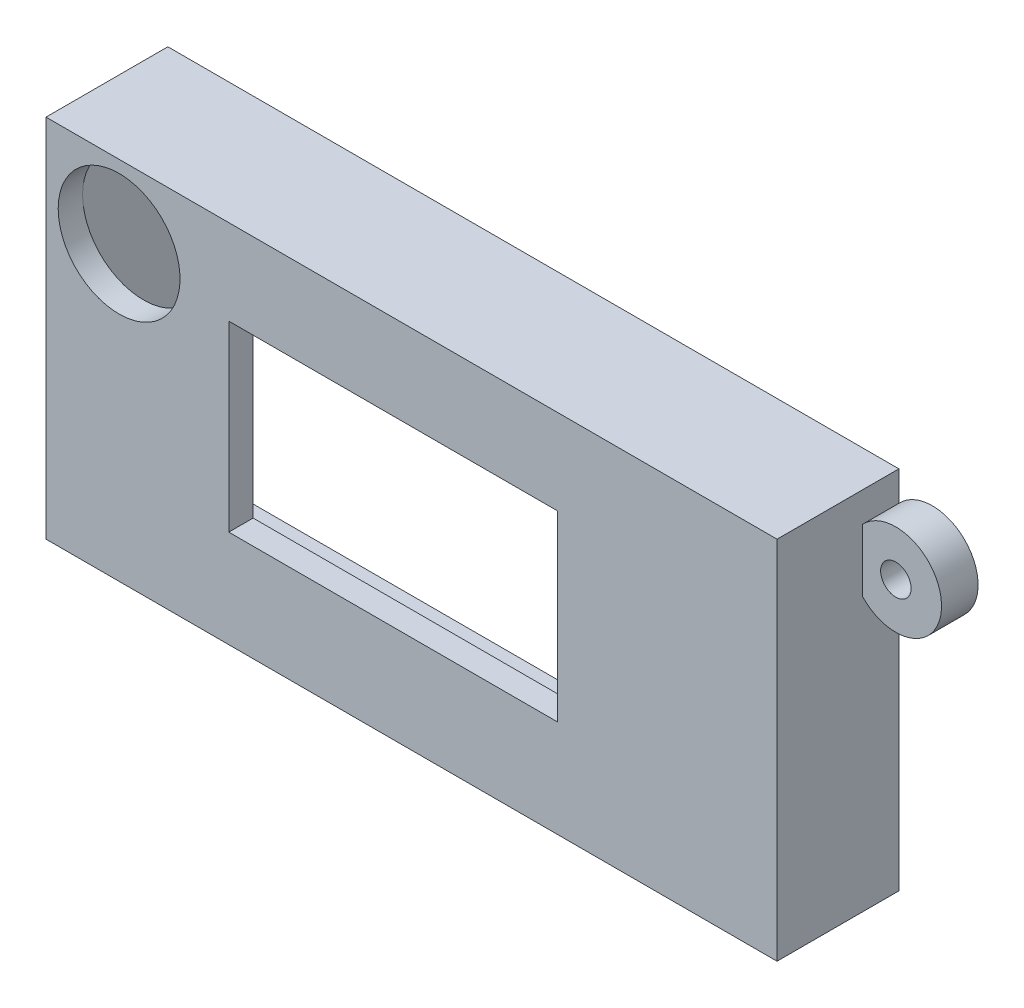
ISO-10303-21;
HEADER;
FILE_DESCRIPTION(('STEP AP214'),'2;1');
FILE_NAME('part.step','',(''),(''),'','','');
FILE_SCHEMA(('AUTOMOTIVE_DESIGN { 1 0 10303 214 1 1 1 1 }'));
ENDSEC;
DATA;
#1=APPLICATION_CONTEXT('core data for automotive mechanical design processes');
#2=APPLICATION_PROTOCOL_DEFINITION('international standard','automotive_design',2000,#1);
#3=PRODUCT_CONTEXT('',#1,'mechanical');
#4=PRODUCT('Part','Part','',(#3));
#5=PRODUCT_RELATED_PRODUCT_CATEGORY('part','',(#4));
#6=PRODUCT_DEFINITION_FORMATION('','',#4);
#7=PRODUCT_DEFINITION_CONTEXT('part definition',#1,'design');
#8=PRODUCT_DEFINITION('design','',#6,#7);
#9=PRODUCT_DEFINITION_SHAPE('','',#8);
#10=(LENGTH_UNIT() NAMED_UNIT(*) SI_UNIT(.MILLI.,.METRE.));
#11=(NAMED_UNIT(*) PLANE_ANGLE_UNIT() SI_UNIT($,.RADIAN.));
#12=(NAMED_UNIT(*) SI_UNIT($,.STERADIAN.) SOLID_ANGLE_UNIT());
#13=UNCERTAINTY_MEASURE_WITH_UNIT(LENGTH_MEASURE(1.E-05),#10,'distance_accuracy_value','');
#14=(GEOMETRIC_REPRESENTATION_CONTEXT(3) GLOBAL_UNCERTAINTY_ASSIGNED_CONTEXT((#13)) GLOBAL_UNIT_ASSIGNED_CONTEXT((#10,
#11,#12)) REPRESENTATION_CONTEXT('',''));
#15=CARTESIAN_POINT('',(0.,0.,0.));
#16=DIRECTION('',(0.,0.,1.));
#17=DIRECTION('',(1.,0.,0.));
#18=AXIS2_PLACEMENT_3D('',#15,#16,#17);
#19=CARTESIAN_POINT('',(-33.0589100278579,-10.,3.));
#20=DIRECTION('',(0.,0.,-1.));
#21=DIRECTION('',(-1.,0.,0.));
#22=AXIS2_PLACEMENT_3D('',#19,#20,#21);
#23=CYLINDRICAL_SURFACE('',#22,3.62551172091565);
#24=CARTESIAN_POINT('',(-33.0589100278579,-10.,0.));
#25=DIRECTION('',(0.,0.,1.));
#26=DIRECTION('',(1.,0.,0.));
#27=AXIS2_PLACEMENT_3D('',#24,#25,#26);
#28=CIRCLE('',#27,3.62551172091565);
#29=CARTESIAN_POINT('',(-30.,-8.05387444393554,0.));
#30=VERTEX_POINT('',#29);
#31=CARTESIAN_POINT('',(-30.,-11.9461255560645,0.));
#32=VERTEX_POINT('',#31);
#33=EDGE_CURVE('E81',#30,#32,#28,.T.);
#34=ORIENTED_EDGE('',*,*,#33,.T.);
#35=DIRECTION('',(0.,0.,-1.));
#36=VECTOR('',#35,1.);
#37=CARTESIAN_POINT('',(-30.,-11.9461255560645,3.));
#38=LINE('',#37,#36);
#39=CARTESIAN_POINT('',(-30.,-11.9461255560645,3.));
#40=VERTEX_POINT('',#39);
#41=EDGE_CURVE('E12',#40,#32,#38,.T.);
#42=ORIENTED_EDGE('',*,*,#41,.F.);
#43=CARTESIAN_POINT('',(-33.0589100278579,-10.,3.));
#44=DIRECTION('',(0.,0.,1.));
#45=DIRECTION('',(1.,0.,0.));
#46=AXIS2_PLACEMENT_3D('',#43,#44,#45);
#47=CIRCLE('',#46,3.62551172091565);
#48=CARTESIAN_POINT('',(-30.,-8.05387444393554,3.));
#49=VERTEX_POINT('',#48);
#50=EDGE_CURVE('E83',#49,#40,#47,.T.);
#51=ORIENTED_EDGE('',*,*,#50,.F.);
#52=DIRECTION('',(0.,0.,-1.));
#53=VECTOR('',#52,1.);
#54=CARTESIAN_POINT('',(-30.,-8.05387444393554,3.));
#55=LINE('',#54,#53);
#56=EDGE_CURVE('E65',#49,#30,#55,.T.);
#57=ORIENTED_EDGE('',*,*,#56,.T.);
#58=EDGE_LOOP('',(#34,#42,#51,#57));
#59=FACE_BOUND('',#58,.T.);
#60=ADVANCED_FACE('F57',(#59),#23,.T.);
#61=CARTESIAN_POINT('',(-30.,-8.05387444393554,3.));
#62=DIRECTION('',(1.,0.,0.));
#63=DIRECTION('',(0.,0.,-1.));
#64=AXIS2_PLACEMENT_3D('',#61,#62,#63);
#65=PLANE('',#64);
#66=DIRECTION('',(0.,-1.,0.));
#67=VECTOR('',#66,1.);
#68=CARTESIAN_POINT('',(-30.,-8.05387444393554,0.));
#69=LINE('',#68,#67);
#70=EDGE_CURVE('E88',#30,#32,#69,.T.);
#71=ORIENTED_EDGE('',*,*,#70,.F.);
#72=ORIENTED_EDGE('',*,*,#56,.F.);
#73=DIRECTION('',(0.,-1.,0.));
#74=VECTOR('',#73,1.);
#75=CARTESIAN_POINT('',(-30.,-8.05387444393554,3.));
#76=LINE('',#75,#74);
#77=EDGE_CURVE('E85',#49,#40,#76,.T.);
#78=ORIENTED_EDGE('',*,*,#77,.T.);
#79=ORIENTED_EDGE('',*,*,#41,.T.);
#80=EDGE_LOOP('',(#71,#72,#78,#79));
#81=FACE_BOUND('',#80,.T.);
#82=ADVANCED_FACE('F91',(#81),#65,.T.);
#83=CARTESIAN_POINT('',(-33.0589100278579,-10.,3.));
#84=DIRECTION('',(0.,0.,1.));
#85=DIRECTION('',(1.,0.,0.));
#86=AXIS2_PLACEMENT_3D('',#83,#84,#85);
#87=PLANE('',#86);
#88=CARTESIAN_POINT('',(-33.0589100278579,-10.,3.));
#89=DIRECTION('',(0.,0.,1.));
#90=DIRECTION('',(1.,0.,0.));
#91=AXIS2_PLACEMENT_3D('',#88,#89,#90);
#92=CIRCLE('',#91,1.25000000000001);
#93=CARTESIAN_POINT('',(-31.8089100278579,-10.,3.));
#94=VERTEX_POINT('',#93);
#95=EDGE_CURVE('E89',#94,#94,#92,.F.);
#96=ORIENTED_EDGE('',*,*,#95,.T.);
#97=EDGE_LOOP('',(#96));
#98=FACE_BOUND('',#97,.T.);
#99=ORIENTED_EDGE('',*,*,#50,.T.);
#100=ORIENTED_EDGE('',*,*,#77,.F.);
#101=EDGE_LOOP('',(#99,#100));
#102=FACE_BOUND('',#101,.T.);
#103=ADVANCED_FACE('F110',(#98,#102),#87,.T.);
#104=CARTESIAN_POINT('',(-33.0589100278579,-10.,0.));
#105=DIRECTION('',(0.,0.,1.));
#106=DIRECTION('',(1.,0.,0.));
#107=AXIS2_PLACEMENT_3D('',#104,#105,#106);
#108=PLANE('',#107);
#109=CARTESIAN_POINT('',(-33.0589100278579,-10.,0.));
#110=DIRECTION('',(0.,0.,1.));
#111=DIRECTION('',(1.,0.,0.));
#112=AXIS2_PLACEMENT_3D('',#109,#110,#111);
#113=CIRCLE('',#112,1.25000000000001);
#114=CARTESIAN_POINT('',(-31.8089100278579,-10.,0.));
#115=VERTEX_POINT('',#114);
#116=EDGE_CURVE('E98',#115,#115,#113,.T.);
#117=ORIENTED_EDGE('',*,*,#116,.T.);
#118=EDGE_LOOP('',(#117));
#119=FACE_BOUND('',#118,.T.);
#120=ORIENTED_EDGE('',*,*,#33,.F.);
#121=ORIENTED_EDGE('',*,*,#70,.T.);
#122=EDGE_LOOP('',(#120,#121));
#123=FACE_BOUND('',#122,.T.);
#124=ADVANCED_FACE('F87',(#119,#123),#108,.F.);
#125=CARTESIAN_POINT('',(-33.0589100278579,-10.,10.));
#126=DIRECTION('',(0.,0.,-1.));
#127=DIRECTION('',(-1.,0.,0.));
#128=AXIS2_PLACEMENT_3D('',#125,#126,#127);
#129=CYLINDRICAL_SURFACE('',#128,1.25000000000001);
#130=ORIENTED_EDGE('',*,*,#95,.F.);
#131=EDGE_LOOP('',(#130));
#132=FACE_BOUND('',#131,.T.);
#133=ORIENTED_EDGE('',*,*,#116,.F.);
#134=EDGE_LOOP('',(#133));
#135=FACE_BOUND('',#134,.T.);
#136=ADVANCED_FACE('F103',(#132,#135),#129,.F.);
#137=CLOSED_SHELL('',(#60,#82,#103,#124,#136));
#138=MANIFOLD_SOLID_BREP('B2',#137);
#139=CARTESIAN_POINT('',(-29.,14.,8.));
#140=DIRECTION('',(0.,1.,0.));
#141=DIRECTION('',(-1.,0.,0.));
#142=AXIS2_PLACEMENT_3D('',#139,#140,#141);
#143=PLANE('',#142);
#144=DIRECTION('',(0.,0.,-1.));
#145=VECTOR('',#144,1.);
#146=CARTESIAN_POINT('',(-29.,14.,8.));
#147=LINE('',#146,#145);
#148=CARTESIAN_POINT('',(-29.,14.,8.));
#149=VERTEX_POINT('',#148);
#150=CARTESIAN_POINT('',(-29.,14.,0.));
#151=VERTEX_POINT('',#150);
#152=EDGE_CURVE('E331',#149,#151,#147,.T.);
#153=ORIENTED_EDGE('',*,*,#152,.T.);
#154=DIRECTION('',(1.,0.,0.));
#155=VECTOR('',#154,1.);
#156=CARTESIAN_POINT('',(-29.,14.,0.));
#157=LINE('',#156,#155);
#158=CARTESIAN_POINT('',(29.,14.,0.));
#159=VERTEX_POINT('',#158);
#160=EDGE_CURVE('E305',#151,#159,#157,.T.);
#161=ORIENTED_EDGE('',*,*,#160,.T.);
#162=DIRECTION('',(0.,0.,-1.));
#163=VECTOR('',#162,1.);
#164=CARTESIAN_POINT('',(29.,14.,8.));
#165=LINE('',#164,#163);
#166=CARTESIAN_POINT('',(29.,14.,8.));
#167=VERTEX_POINT('',#166);
#168=EDGE_CURVE('E327',#167,#159,#165,.T.);
#169=ORIENTED_EDGE('',*,*,#168,.F.);
#170=DIRECTION('',(1.,0.,0.));
#171=VECTOR('',#170,1.);
#172=CARTESIAN_POINT('',(-29.,14.,8.));
#173=LINE('',#172,#171);
#174=CARTESIAN_POINT('',(-24.,14.,8.));
#175=VERTEX_POINT('',#174);
#176=EDGE_CURVE('E322',#175,#167,#173,.T.);
#177=ORIENTED_EDGE('',*,*,#176,.F.);
#178=EDGE_CURVE('E323',#149,#175,#173,.T.);
#179=ORIENTED_EDGE('',*,*,#178,.F.);
#180=EDGE_LOOP('',(#153,#161,#169,#177,#179));
#181=FACE_BOUND('',#180,.T.);
#182=ADVANCED_FACE('F150',(#181),#143,.F.);
#183=CARTESIAN_POINT('',(-29.,-14.,8.));
#184=DIRECTION('',(-1.,0.,0.));
#185=DIRECTION('',(0.,-1.,0.));
#186=AXIS2_PLACEMENT_3D('',#183,#184,#185);
#187=PLANE('',#186);
#188=DIRECTION('',(0.,0.,-1.));
#189=VECTOR('',#188,1.);
#190=CARTESIAN_POINT('',(-29.,-14.,8.));
#191=LINE('',#190,#189);
#192=CARTESIAN_POINT('',(-29.,-14.,8.));
#193=VERTEX_POINT('',#192);
#194=CARTESIAN_POINT('',(-29.,-14.,0.));
#195=VERTEX_POINT('',#194);
#196=EDGE_CURVE('E334',#193,#195,#191,.T.);
#197=ORIENTED_EDGE('',*,*,#196,.T.);
#198=DIRECTION('',(0.,1.,0.));
#199=VECTOR('',#198,1.);
#200=CARTESIAN_POINT('',(-29.,-14.,0.));
#201=LINE('',#200,#199);
#202=EDGE_CURVE('E301',#195,#151,#201,.T.);
#203=ORIENTED_EDGE('',*,*,#202,.T.);
#204=ORIENTED_EDGE('',*,*,#152,.F.);
#205=DIRECTION('',(0.,1.,0.));
#206=VECTOR('',#205,1.);
#207=CARTESIAN_POINT('',(-29.,-14.,8.));
#208=LINE('',#207,#206);
#209=CARTESIAN_POINT('',(-29.,9.,8.));
#210=VERTEX_POINT('',#209);
#211=EDGE_CURVE('E317',#210,#149,#208,.T.);
#212=ORIENTED_EDGE('',*,*,#211,.F.);
#213=EDGE_CURVE('E318',#193,#210,#208,.T.);
#214=ORIENTED_EDGE('',*,*,#213,.F.);
#215=EDGE_LOOP('',(#197,#203,#204,#212,#214));
#216=FACE_BOUND('',#215,.T.);
#217=ADVANCED_FACE('F444',(#216),#187,.F.);
#218=CARTESIAN_POINT('',(29.,-14.,8.));
#219=DIRECTION('',(1.,0.,0.));
#220=DIRECTION('',(0.,0.,-1.));
#221=AXIS2_PLACEMENT_3D('',#218,#219,#220);
#222=PLANE('',#221);
#223=ORIENTED_EDGE('',*,*,#168,.T.);
#224=DIRECTION('',(0.,-1.,0.));
#225=VECTOR('',#224,1.);
#226=CARTESIAN_POINT('',(29.,-14.,0.));
#227=LINE('',#226,#225);
#228=CARTESIAN_POINT('',(29.,-14.,0.));
#229=VERTEX_POINT('',#228);
#230=EDGE_CURVE('E292',#159,#229,#227,.T.);
#231=ORIENTED_EDGE('',*,*,#230,.T.);
#232=DIRECTION('',(0.,0.,-1.));
#233=VECTOR('',#232,1.);
#234=CARTESIAN_POINT('',(29.,-14.,8.));
#235=LINE('',#234,#233);
#236=CARTESIAN_POINT('',(29.,-14.,8.));
#237=VERTEX_POINT('',#236);
#238=EDGE_CURVE('E326',#237,#229,#235,.T.);
#239=ORIENTED_EDGE('',*,*,#238,.F.);
#240=DIRECTION('',(0.,-1.,0.));
#241=VECTOR('',#240,1.);
#242=CARTESIAN_POINT('',(29.,-14.,8.));
#243=LINE('',#242,#241);
#244=EDGE_CURVE('E309',#167,#237,#243,.T.);
#245=ORIENTED_EDGE('',*,*,#244,.F.);
#246=EDGE_LOOP('',(#223,#231,#239,#245));
#247=FACE_BOUND('',#246,.T.);
#248=ADVANCED_FACE('F451',(#247),#222,.F.);
#249=CARTESIAN_POINT('',(-29.,-14.,8.));
#250=DIRECTION('',(0.,-1.,0.));
#251=DIRECTION('',(1.,0.,0.));
#252=AXIS2_PLACEMENT_3D('',#249,#250,#251);
#253=PLANE('',#252);
#254=ORIENTED_EDGE('',*,*,#238,.T.);
#255=DIRECTION('',(-1.,0.,0.));
#256=VECTOR('',#255,1.);
#257=CARTESIAN_POINT('',(-29.,-14.,0.));
#258=LINE('',#257,#256);
#259=EDGE_CURVE('E297',#229,#195,#258,.T.);
#260=ORIENTED_EDGE('',*,*,#259,.T.);
#261=ORIENTED_EDGE('',*,*,#196,.F.);
#262=DIRECTION('',(-1.,0.,0.));
#263=VECTOR('',#262,1.);
#264=CARTESIAN_POINT('',(-29.,-14.,8.));
#265=LINE('',#264,#263);
#266=EDGE_CURVE('E313',#237,#193,#265,.T.);
#267=ORIENTED_EDGE('',*,*,#266,.F.);
#268=EDGE_LOOP('',(#254,#260,#261,#267));
#269=FACE_BOUND('',#268,.T.);
#270=ADVANCED_FACE('F458',(#269),#253,.F.);
#271=CARTESIAN_POINT('',(-24.,9.,10.));
#272=DIRECTION('',(0.,0.,-1.));
#273=DIRECTION('',(-1.,0.,0.));
#274=AXIS2_PLACEMENT_3D('',#271,#272,#273);
#275=CYLINDRICAL_SURFACE('',#274,5.);
#276=CARTESIAN_POINT('',(-24.,9.,10.));
#277=DIRECTION('',(0.,0.,-1.));
#278=DIRECTION('',(-1.,0.,0.));
#279=AXIS2_PLACEMENT_3D('',#276,#277,#278);
#280=CIRCLE('',#279,5.);
#281=CARTESIAN_POINT('',(-29.,9.,10.));
#282=VERTEX_POINT('',#281);
#283=EDGE_CURVE('E356',#282,#282,#280,.T.);
#284=ORIENTED_EDGE('',*,*,#283,.F.);
#285=EDGE_LOOP('',(#284));
#286=FACE_BOUND('',#285,.T.);
#287=CARTESIAN_POINT('',(-24.,9.,8.));
#288=DIRECTION('',(0.,0.,-1.));
#289=DIRECTION('',(-1.,0.,0.));
#290=AXIS2_PLACEMENT_3D('',#287,#288,#289);
#291=CIRCLE('',#290,5.);
#292=EDGE_CURVE('E350',#210,#175,#291,.F.);
#293=ORIENTED_EDGE('',*,*,#292,.F.);
#294=EDGE_CURVE('E347',#175,#210,#291,.F.);
#295=ORIENTED_EDGE('',*,*,#294,.F.);
#296=EDGE_LOOP('',(#293,#295));
#297=FACE_BOUND('',#296,.T.);
#298=ADVANCED_FACE('F460',(#286,#297),#275,.F.);
#299=CARTESIAN_POINT('',(-15.,8.,10.));
#300=DIRECTION('',(-1.,0.,0.));
#301=DIRECTION('',(0.,-1.,0.));
#302=AXIS2_PLACEMENT_3D('',#299,#300,#301);
#303=PLANE('',#302);
#304=DIRECTION('',(0.,-1.,0.));
#305=VECTOR('',#304,1.);
#306=CARTESIAN_POINT('',(-15.,8.,8.));
#307=LINE('',#306,#305);
#308=CARTESIAN_POINT('',(-15.,8.,8.));
#309=VERTEX_POINT('',#308);
#310=CARTESIAN_POINT('',(-15.,-7.,8.));
#311=VERTEX_POINT('',#310);
#312=EDGE_CURVE('E344',#309,#311,#307,.T.);
#313=ORIENTED_EDGE('',*,*,#312,.F.);
#314=DIRECTION('',(0.,0.,-1.));
#315=VECTOR('',#314,1.);
#316=CARTESIAN_POINT('',(-15.,8.,10.));
#317=LINE('',#316,#315);
#318=CARTESIAN_POINT('',(-15.,8.,10.));
#319=VERTEX_POINT('',#318);
#320=EDGE_CURVE('E368',#319,#309,#317,.T.);
#321=ORIENTED_EDGE('',*,*,#320,.F.);
#322=DIRECTION('',(0.,1.,0.));
#323=VECTOR('',#322,1.);
#324=CARTESIAN_POINT('',(-15.,8.,10.));
#325=LINE('',#324,#323);
#326=CARTESIAN_POINT('',(-15.,-7.,10.));
#327=VERTEX_POINT('',#326);
#328=EDGE_CURVE('E351',#327,#319,#325,.T.);
#329=ORIENTED_EDGE('',*,*,#328,.F.);
#330=DIRECTION('',(0.,0.,-1.));
#331=VECTOR('',#330,1.);
#332=CARTESIAN_POINT('',(-15.,-7.,10.));
#333=LINE('',#332,#331);
#334=EDGE_CURVE('E269',#327,#311,#333,.T.);
#335=ORIENTED_EDGE('',*,*,#334,.T.);
#336=EDGE_LOOP('',(#313,#321,#329,#335));
#337=FACE_BOUND('',#336,.T.);
#338=ADVANCED_FACE('F469',(#337),#303,.F.);
#339=CARTESIAN_POINT('',(12.,-7.,10.));
#340=DIRECTION('',(0.,-1.,0.));
#341=DIRECTION('',(0.,0.,-1.));
#342=AXIS2_PLACEMENT_3D('',#339,#340,#341);
#343=PLANE('',#342);
#344=DIRECTION('',(1.,0.,0.));
#345=VECTOR('',#344,1.);
#346=CARTESIAN_POINT('',(12.,-7.,8.));
#347=LINE('',#346,#345);
#348=CARTESIAN_POINT('',(12.,-7.,8.));
#349=VERTEX_POINT('',#348);
#350=EDGE_CURVE('E341',#311,#349,#347,.T.);
#351=ORIENTED_EDGE('',*,*,#350,.F.);
#352=ORIENTED_EDGE('',*,*,#334,.F.);
#353=DIRECTION('',(-1.,0.,0.));
#354=VECTOR('',#353,1.);
#355=CARTESIAN_POINT('',(12.,-7.,10.));
#356=LINE('',#355,#354);
#357=CARTESIAN_POINT('',(12.,-7.,10.));
#358=VERTEX_POINT('',#357);
#359=EDGE_CURVE('E364',#358,#327,#356,.T.);
#360=ORIENTED_EDGE('',*,*,#359,.F.);
#361=DIRECTION('',(0.,0.,-1.));
#362=VECTOR('',#361,1.);
#363=CARTESIAN_POINT('',(12.,-7.,10.));
#364=LINE('',#363,#362);
#365=EDGE_CURVE('E372',#358,#349,#364,.T.);
#366=ORIENTED_EDGE('',*,*,#365,.T.);
#367=EDGE_LOOP('',(#351,#352,#360,#366));
#368=FACE_BOUND('',#367,.T.);
#369=ADVANCED_FACE('F465',(#368),#343,.F.);
#370=CARTESIAN_POINT('',(12.,8.,10.));
#371=DIRECTION('',(1.,0.,0.));
#372=DIRECTION('',(0.,1.,0.));
#373=AXIS2_PLACEMENT_3D('',#370,#371,#372);
#374=PLANE('',#373);
#375=DIRECTION('',(0.,1.,0.));
#376=VECTOR('',#375,1.);
#377=CARTESIAN_POINT('',(12.,8.,8.));
#378=LINE('',#377,#376);
#379=CARTESIAN_POINT('',(12.,8.,8.));
#380=VERTEX_POINT('',#379);
#381=EDGE_CURVE('E330',#349,#380,#378,.T.);
#382=ORIENTED_EDGE('',*,*,#381,.F.);
#383=ORIENTED_EDGE('',*,*,#365,.F.);
#384=DIRECTION('',(0.,-1.,0.));
#385=VECTOR('',#384,1.);
#386=CARTESIAN_POINT('',(12.,8.,10.));
#387=LINE('',#386,#385);
#388=CARTESIAN_POINT('',(12.,8.,10.));
#389=VERTEX_POINT('',#388);
#390=EDGE_CURVE('E360',#389,#358,#387,.T.);
#391=ORIENTED_EDGE('',*,*,#390,.F.);
#392=DIRECTION('',(0.,0.,-1.));
#393=VECTOR('',#392,1.);
#394=CARTESIAN_POINT('',(12.,8.,10.));
#395=LINE('',#394,#393);
#396=EDGE_CURVE('E376',#389,#380,#395,.T.);
#397=ORIENTED_EDGE('',*,*,#396,.T.);
#398=EDGE_LOOP('',(#382,#383,#391,#397));
#399=FACE_BOUND('',#398,.T.);
#400=ADVANCED_FACE('F468',(#399),#374,.F.);
#401=CARTESIAN_POINT('',(12.,8.,10.));
#402=DIRECTION('',(0.,1.,0.));
#403=DIRECTION('',(0.,0.,1.));
#404=AXIS2_PLACEMENT_3D('',#401,#402,#403);
#405=PLANE('',#404);
#406=DIRECTION('',(-1.,0.,0.));
#407=VECTOR('',#406,1.);
#408=CARTESIAN_POINT('',(12.,8.,8.));
#409=LINE('',#408,#407);
#410=EDGE_CURVE('E55',#380,#309,#409,.T.);
#411=ORIENTED_EDGE('',*,*,#410,.F.);
#412=ORIENTED_EDGE('',*,*,#396,.F.);
#413=DIRECTION('',(1.,0.,0.));
#414=VECTOR('',#413,1.);
#415=CARTESIAN_POINT('',(12.,8.,10.));
#416=LINE('',#415,#414);
#417=EDGE_CURVE('E355',#319,#389,#416,.T.);
#418=ORIENTED_EDGE('',*,*,#417,.F.);
#419=ORIENTED_EDGE('',*,*,#320,.T.);
#420=EDGE_LOOP('',(#411,#412,#418,#419));
#421=FACE_BOUND('',#420,.T.);
#422=ADVANCED_FACE('F473',(#421),#405,.F.);
#423=CARTESIAN_POINT('',(30.,15.,10.));
#424=DIRECTION('',(-1.,0.,0.));
#425=DIRECTION('',(0.,-1.,0.));
#426=AXIS2_PLACEMENT_3D('',#423,#424,#425);
#427=PLANE('',#426);
#428=DIRECTION('',(0.,-1.,0.));
#429=VECTOR('',#428,1.);
#430=CARTESIAN_POINT('',(30.,0.,3.));
#431=LINE('',#430,#429);
#432=CARTESIAN_POINT('',(30.,12.5495097567964,3.));
#433=VERTEX_POINT('',#432);
#434=CARTESIAN_POINT('',(30.,7.4504902432036,3.));
#435=VERTEX_POINT('',#434);
#436=EDGE_CURVE('E170',#433,#435,#431,.T.);
#437=ORIENTED_EDGE('',*,*,#436,.F.);
#438=DIRECTION('',(0.,0.,-1.));
#439=VECTOR('',#438,1.);
#440=CARTESIAN_POINT('',(30.,12.5495097567964,3.));
#441=LINE('',#440,#439);
#442=CARTESIAN_POINT('',(30.,12.5495097567964,0.));
#443=VERTEX_POINT('',#442);
#444=EDGE_CURVE('E271',#433,#443,#441,.T.);
#445=ORIENTED_EDGE('',*,*,#444,.T.);
#446=DIRECTION('',(0.,1.,0.));
#447=VECTOR('',#446,1.);
#448=CARTESIAN_POINT('',(30.,15.,0.));
#449=LINE('',#448,#447);
#450=CARTESIAN_POINT('',(30.,15.,0.));
#451=VERTEX_POINT('',#450);
#452=EDGE_CURVE('E256',#443,#451,#449,.T.);
#453=ORIENTED_EDGE('',*,*,#452,.T.);
#454=DIRECTION('',(0.,0.,-1.));
#455=VECTOR('',#454,1.);
#456=CARTESIAN_POINT('',(30.,15.,10.));
#457=LINE('',#456,#455);
#458=CARTESIAN_POINT('',(30.,15.,10.));
#459=VERTEX_POINT('',#458);
#460=EDGE_CURVE('E159',#459,#451,#457,.T.);
#461=ORIENTED_EDGE('',*,*,#460,.F.);
#462=DIRECTION('',(0.,1.,0.));
#463=VECTOR('',#462,1.);
#464=CARTESIAN_POINT('',(30.,15.,10.));
#465=LINE('',#464,#463);
#466=CARTESIAN_POINT('',(30.,-15.,10.));
#467=VERTEX_POINT('',#466);
#468=EDGE_CURVE('E386',#467,#459,#465,.T.);
#469=ORIENTED_EDGE('',*,*,#468,.F.);
#470=DIRECTION('',(0.,0.,-1.));
#471=VECTOR('',#470,1.);
#472=CARTESIAN_POINT('',(30.,-15.,10.));
#473=LINE('',#472,#471);
#474=CARTESIAN_POINT('',(30.,-15.,0.));
#475=VERTEX_POINT('',#474);
#476=EDGE_CURVE('E399',#467,#475,#473,.T.);
#477=ORIENTED_EDGE('',*,*,#476,.T.);
#478=CARTESIAN_POINT('',(30.,7.45049024320361,0.));
#479=VERTEX_POINT('',#478);
#480=EDGE_CURVE('E268',#475,#479,#449,.T.);
#481=ORIENTED_EDGE('',*,*,#480,.T.);
#482=DIRECTION('',(0.,0.,-1.));
#483=VECTOR('',#482,1.);
#484=CARTESIAN_POINT('',(30.,7.4504902432036,3.));
#485=LINE('',#484,#483);
#486=EDGE_CURVE('E166',#435,#479,#485,.T.);
#487=ORIENTED_EDGE('',*,*,#486,.F.);
#488=EDGE_LOOP('',(#437,#445,#453,#461,#469,#477,#481,#487));
#489=FACE_BOUND('',#488,.T.);
#490=ADVANCED_FACE('F152',(#489),#427,.F.);
#491=CARTESIAN_POINT('',(-30.,15.,10.));
#492=DIRECTION('',(0.,-1.,0.));
#493=DIRECTION('',(0.,0.,-1.));
#494=AXIS2_PLACEMENT_3D('',#491,#492,#493);
#495=PLANE('',#494);
#496=DIRECTION('',(-1.,0.,0.));
#497=VECTOR('',#496,1.);
#498=CARTESIAN_POINT('',(-30.,15.,0.));
#499=LINE('',#498,#497);
#500=CARTESIAN_POINT('',(-30.,15.,0.));
#501=VERTEX_POINT('',#500);
#502=EDGE_CURVE('E264',#451,#501,#499,.T.);
#503=ORIENTED_EDGE('',*,*,#502,.T.);
#504=DIRECTION('',(0.,0.,-1.));
#505=VECTOR('',#504,1.);
#506=CARTESIAN_POINT('',(-30.,15.,10.));
#507=LINE('',#506,#505);
#508=CARTESIAN_POINT('',(-30.,15.,10.));
#509=VERTEX_POINT('',#508);
#510=EDGE_CURVE('E416',#509,#501,#507,.T.);
#511=ORIENTED_EDGE('',*,*,#510,.F.);
#512=DIRECTION('',(-1.,0.,0.));
#513=VECTOR('',#512,1.);
#514=CARTESIAN_POINT('',(-30.,15.,10.));
#515=LINE('',#514,#513);
#516=EDGE_CURVE('E390',#459,#509,#515,.T.);
#517=ORIENTED_EDGE('',*,*,#516,.F.);
#518=ORIENTED_EDGE('',*,*,#460,.T.);
#519=EDGE_LOOP('',(#503,#511,#517,#518));
#520=FACE_BOUND('',#519,.T.);
#521=ADVANCED_FACE('F421',(#520),#495,.F.);
#522=CARTESIAN_POINT('',(-30.,15.,10.));
#523=DIRECTION('',(1.,0.,0.));
#524=DIRECTION('',(0.,1.,0.));
#525=AXIS2_PLACEMENT_3D('',#522,#523,#524);
#526=PLANE('',#525);
#527=DIRECTION('',(0.,-1.,0.));
#528=VECTOR('',#527,1.);
#529=CARTESIAN_POINT('',(-30.,15.,0.));
#530=LINE('',#529,#528);
#531=CARTESIAN_POINT('',(-30.,-15.,0.));
#532=VERTEX_POINT('',#531);
#533=EDGE_CURVE('E404',#501,#532,#530,.T.);
#534=ORIENTED_EDGE('',*,*,#533,.T.);
#535=DIRECTION('',(0.,0.,-1.));
#536=VECTOR('',#535,1.);
#537=CARTESIAN_POINT('',(-30.,-15.,10.));
#538=LINE('',#537,#536);
#539=CARTESIAN_POINT('',(-30.,-15.,10.));
#540=VERTEX_POINT('',#539);
#541=EDGE_CURVE('E412',#540,#532,#538,.T.);
#542=ORIENTED_EDGE('',*,*,#541,.F.);
#543=DIRECTION('',(0.,-1.,0.));
#544=VECTOR('',#543,1.);
#545=CARTESIAN_POINT('',(-30.,15.,10.));
#546=LINE('',#545,#544);
#547=EDGE_CURVE('E394',#509,#540,#546,.T.);
#548=ORIENTED_EDGE('',*,*,#547,.F.);
#549=ORIENTED_EDGE('',*,*,#510,.T.);
#550=EDGE_LOOP('',(#534,#542,#548,#549));
#551=FACE_BOUND('',#550,.T.);
#552=ADVANCED_FACE('F433',(#551),#526,.F.);
#553=CARTESIAN_POINT('',(-30.,-15.,10.));
#554=DIRECTION('',(0.,1.,0.));
#555=DIRECTION('',(0.,0.,1.));
#556=AXIS2_PLACEMENT_3D('',#553,#554,#555);
#557=PLANE('',#556);
#558=DIRECTION('',(1.,0.,0.));
#559=VECTOR('',#558,1.);
#560=CARTESIAN_POINT('',(-30.,-15.,0.));
#561=LINE('',#560,#559);
#562=EDGE_CURVE('E391',#532,#475,#561,.T.);
#563=ORIENTED_EDGE('',*,*,#562,.T.);
#564=ORIENTED_EDGE('',*,*,#476,.F.);
#565=DIRECTION('',(1.,0.,0.));
#566=VECTOR('',#565,1.);
#567=CARTESIAN_POINT('',(-30.,-15.,10.));
#568=LINE('',#567,#566);
#569=EDGE_CURVE('E397',#540,#467,#568,.T.);
#570=ORIENTED_EDGE('',*,*,#569,.F.);
#571=ORIENTED_EDGE('',*,*,#541,.T.);
#572=EDGE_LOOP('',(#563,#564,#570,#571));
#573=FACE_BOUND('',#572,.T.);
#574=ADVANCED_FACE('F431',(#573),#557,.F.);
#575=CARTESIAN_POINT('',(0.,0.,10.));
#576=DIRECTION('',(0.,0.,1.));
#577=DIRECTION('',(1.,0.,0.));
#578=AXIS2_PLACEMENT_3D('',#575,#576,#577);
#579=PLANE('',#578);
#580=ORIENTED_EDGE('',*,*,#328,.T.);
#581=ORIENTED_EDGE('',*,*,#417,.T.);
#582=ORIENTED_EDGE('',*,*,#390,.T.);
#583=ORIENTED_EDGE('',*,*,#359,.T.);
#584=EDGE_LOOP('',(#580,#581,#582,#583));
#585=FACE_BOUND('',#584,.T.);
#586=ORIENTED_EDGE('',*,*,#283,.T.);
#587=EDGE_LOOP('',(#586));
#588=FACE_BOUND('',#587,.T.);
#589=ORIENTED_EDGE('',*,*,#468,.T.);
#590=ORIENTED_EDGE('',*,*,#516,.T.);
#591=ORIENTED_EDGE('',*,*,#547,.T.);
#592=ORIENTED_EDGE('',*,*,#569,.T.);
#593=EDGE_LOOP('',(#589,#590,#591,#592));
#594=FACE_BOUND('',#593,.T.);
#595=ADVANCED_FACE('F426',(#585,#588,#594),#579,.T.);
#596=CARTESIAN_POINT('',(0.,0.,0.));
#597=DIRECTION('',(0.,0.,1.));
#598=DIRECTION('',(1.,0.,0.));
#599=AXIS2_PLACEMENT_3D('',#596,#597,#598);
#600=PLANE('',#599);
#601=ORIENTED_EDGE('',*,*,#259,.F.);
#602=ORIENTED_EDGE('',*,*,#230,.F.);
#603=ORIENTED_EDGE('',*,*,#160,.F.);
#604=ORIENTED_EDGE('',*,*,#202,.F.);
#605=EDGE_LOOP('',(#601,#602,#603,#604));
#606=FACE_BOUND('',#605,.T.);
#607=ORIENTED_EDGE('',*,*,#562,.F.);
#608=ORIENTED_EDGE('',*,*,#533,.F.);
#609=ORIENTED_EDGE('',*,*,#502,.F.);
#610=ORIENTED_EDGE('',*,*,#452,.F.);
#611=CARTESIAN_POINT('',(32.75,10.,0.));
#612=DIRECTION('',(0.,0.,-1.));
#613=DIRECTION('',(-1.,0.,0.));
#614=AXIS2_PLACEMENT_3D('',#611,#612,#613);
#615=CIRCLE('',#614,3.75);
#616=EDGE_CURVE('E262',#443,#479,#615,.T.);
#617=ORIENTED_EDGE('',*,*,#616,.T.);
#618=ORIENTED_EDGE('',*,*,#480,.F.);
#619=EDGE_LOOP('',(#607,#608,#609,#610,#617,#618));
#620=FACE_BOUND('',#619,.T.);
#621=CARTESIAN_POINT('',(32.75,10.,0.));
#622=DIRECTION('',(0.,0.,-1.));
#623=DIRECTION('',(-1.,0.,0.));
#624=AXIS2_PLACEMENT_3D('',#621,#622,#623);
#625=CIRCLE('',#624,1.25);
#626=CARTESIAN_POINT('',(31.5,10.,0.));
#627=VERTEX_POINT('',#626);
#628=EDGE_CURVE('E281',#627,#627,#625,.T.);
#629=ORIENTED_EDGE('',*,*,#628,.F.);
#630=EDGE_LOOP('',(#629));
#631=FACE_BOUND('',#630,.T.);
#632=ADVANCED_FACE('F258',(#606,#620,#631),#600,.F.);
#633=CARTESIAN_POINT('',(0.,0.,8.));
#634=DIRECTION('',(0.,0.,-1.));
#635=DIRECTION('',(-1.,0.,0.));
#636=AXIS2_PLACEMENT_3D('',#633,#634,#635);
#637=PLANE('',#636);
#638=ORIENTED_EDGE('',*,*,#312,.T.);
#639=ORIENTED_EDGE('',*,*,#350,.T.);
#640=ORIENTED_EDGE('',*,*,#381,.T.);
#641=ORIENTED_EDGE('',*,*,#410,.T.);
#642=EDGE_LOOP('',(#638,#639,#640,#641));
#643=FACE_BOUND('',#642,.T.);
#644=ORIENTED_EDGE('',*,*,#292,.T.);
#645=ORIENTED_EDGE('',*,*,#176,.T.);
#646=ORIENTED_EDGE('',*,*,#244,.T.);
#647=ORIENTED_EDGE('',*,*,#266,.T.);
#648=ORIENTED_EDGE('',*,*,#213,.T.);
#649=EDGE_LOOP('',(#644,#645,#646,#647,#648));
#650=FACE_BOUND('',#649,.T.);
#651=ADVANCED_FACE('F455',(#643,#650),#637,.T.);
#652=ORIENTED_EDGE('',*,*,#294,.T.);
#653=ORIENTED_EDGE('',*,*,#211,.T.);
#654=ORIENTED_EDGE('',*,*,#178,.T.);
#655=EDGE_LOOP('',(#652,#653,#654));
#656=FACE_BOUND('',#655,.T.);
#657=ADVANCED_FACE('F493',(#656),#637,.T.);
#658=CARTESIAN_POINT('',(32.75,10.,3.));
#659=DIRECTION('',(0.,0.,-1.));
#660=DIRECTION('',(-1.,0.,0.));
#661=AXIS2_PLACEMENT_3D('',#658,#659,#660);
#662=CYLINDRICAL_SURFACE('',#661,1.25);
#663=CARTESIAN_POINT('',(32.75,10.,3.));
#664=DIRECTION('',(0.,0.,-1.));
#665=DIRECTION('',(-1.,0.,0.));
#666=AXIS2_PLACEMENT_3D('',#663,#664,#665);
#667=CIRCLE('',#666,1.25);
#668=CARTESIAN_POINT('',(31.5,10.,3.));
#669=VERTEX_POINT('',#668);
#670=EDGE_CURVE('E280',#669,#669,#667,.T.);
#671=ORIENTED_EDGE('',*,*,#670,.F.);
#672=EDGE_LOOP('',(#671));
#673=FACE_BOUND('',#672,.T.);
#674=ORIENTED_EDGE('',*,*,#628,.T.);
#675=EDGE_LOOP('',(#674));
#676=FACE_BOUND('',#675,.T.);
#677=ADVANCED_FACE('F524',(#673,#676),#662,.F.);
#678=CARTESIAN_POINT('',(32.75,10.,3.));
#679=DIRECTION('',(0.,0.,-1.));
#680=DIRECTION('',(-1.,0.,0.));
#681=AXIS2_PLACEMENT_3D('',#678,#679,#680);
#682=CYLINDRICAL_SURFACE('',#681,3.75);
#683=ORIENTED_EDGE('',*,*,#616,.F.);
#684=ORIENTED_EDGE('',*,*,#444,.F.);
#685=CARTESIAN_POINT('',(32.75,10.,3.));
#686=DIRECTION('',(0.,0.,-1.));
#687=DIRECTION('',(-1.,0.,0.));
#688=AXIS2_PLACEMENT_3D('',#685,#686,#687);
#689=CIRCLE('',#688,3.75);
#690=EDGE_CURVE('E276',#433,#435,#689,.T.);
#691=ORIENTED_EDGE('',*,*,#690,.T.);
#692=ORIENTED_EDGE('',*,*,#486,.T.);
#693=EDGE_LOOP('',(#683,#684,#691,#692));
#694=FACE_BOUND('',#693,.T.);
#695=ADVANCED_FACE('F278',(#694),#682,.T.);
#696=CARTESIAN_POINT('',(0.,0.,3.));
#697=DIRECTION('',(0.,0.,-1.));
#698=DIRECTION('',(-1.,0.,0.));
#699=AXIS2_PLACEMENT_3D('',#696,#697,#698);
#700=PLANE('',#699);
#701=ORIENTED_EDGE('',*,*,#670,.T.);
#702=EDGE_LOOP('',(#701));
#703=FACE_BOUND('',#702,.T.);
#704=ORIENTED_EDGE('',*,*,#436,.T.);
#705=ORIENTED_EDGE('',*,*,#690,.F.);
#706=EDGE_LOOP('',(#704,#705));
#707=FACE_BOUND('',#706,.T.);
#708=ADVANCED_FACE('F517',(#703,#707),#700,.F.);
#709=CLOSED_SHELL('',(#182,#217,#248,#270,#298,#338,#369,#400,#422,#490,#521,#552,#574,#595,
#632,#651,#657,#677,#695,#708));
#710=MANIFOLD_SOLID_BREP('B6',#709);
#711=ADVANCED_BREP_SHAPE_REPRESENTATION('',(#18,#138,#710),#14);
#712=SHAPE_DEFINITION_REPRESENTATION(#9,#711);
ENDSEC;
END-ISO-10303-21;
